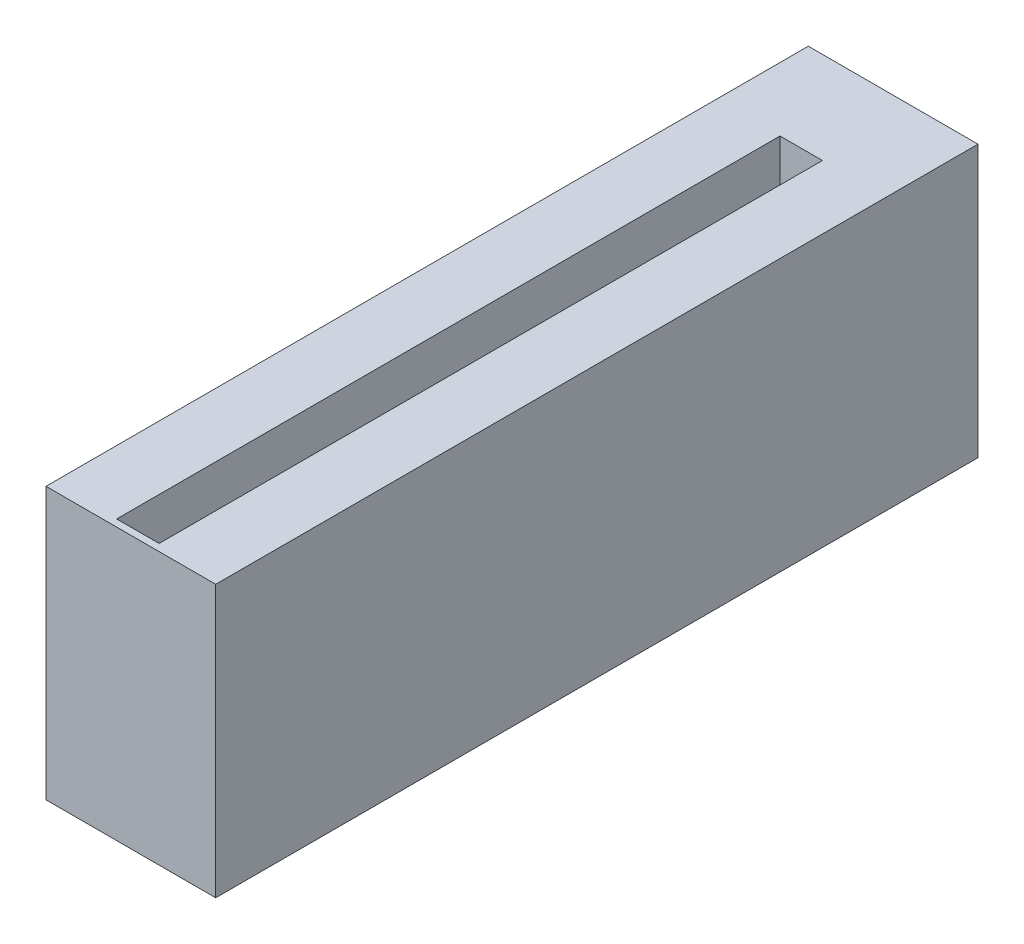
ISO-10303-21;
HEADER;
FILE_DESCRIPTION(('STEP AP214'),'2;1');
FILE_NAME('part.step','',(''),(''),'','','');
FILE_SCHEMA(('AUTOMOTIVE_DESIGN { 1 0 10303 214 1 1 1 1 }'));
ENDSEC;
DATA;
#1=APPLICATION_CONTEXT('core data for automotive mechanical design processes');
#2=APPLICATION_PROTOCOL_DEFINITION('international standard','automotive_design',2000,#1);
#3=PRODUCT_CONTEXT('',#1,'mechanical');
#4=PRODUCT('Part','Part','',(#3));
#5=PRODUCT_RELATED_PRODUCT_CATEGORY('part','',(#4));
#6=PRODUCT_DEFINITION_FORMATION('','',#4);
#7=PRODUCT_DEFINITION_CONTEXT('part definition',#1,'design');
#8=PRODUCT_DEFINITION('design','',#6,#7);
#9=PRODUCT_DEFINITION_SHAPE('','',#8);
#10=(LENGTH_UNIT() NAMED_UNIT(*) SI_UNIT(.MILLI.,.METRE.));
#11=(NAMED_UNIT(*) PLANE_ANGLE_UNIT() SI_UNIT($,.RADIAN.));
#12=(NAMED_UNIT(*) SI_UNIT($,.STERADIAN.) SOLID_ANGLE_UNIT());
#13=UNCERTAINTY_MEASURE_WITH_UNIT(LENGTH_MEASURE(1.E-05),#10,'distance_accuracy_value','');
#14=(GEOMETRIC_REPRESENTATION_CONTEXT(3) GLOBAL_UNCERTAINTY_ASSIGNED_CONTEXT((#13)) GLOBAL_UNIT_ASSIGNED_CONTEXT((#10,
#11,#12)) REPRESENTATION_CONTEXT('',''));
#15=CARTESIAN_POINT('',(0.,0.,0.));
#16=DIRECTION('',(0.,0.,1.));
#17=DIRECTION('',(1.,0.,0.));
#18=AXIS2_PLACEMENT_3D('',#15,#16,#17);
#19=CARTESIAN_POINT('',(2.25,-26.9917116908135,-26.95));
#20=DIRECTION('',(-1.,0.,0.));
#21=DIRECTION('',(0.,0.,1.));
#22=AXIS2_PLACEMENT_3D('',#19,#20,#21);
#23=PLANE('',#22);
#24=DIRECTION('',(0.,0.,1.));
#25=VECTOR('',#24,1.);
#26=CARTESIAN_POINT('',(2.25,0.,-26.95));
#27=LINE('',#26,#25);
#28=CARTESIAN_POINT('',(2.25,0.,-23.7));
#29=VERTEX_POINT('',#28);
#30=CARTESIAN_POINT('',(2.25,0.,-0.25));
#31=VERTEX_POINT('',#30);
#32=EDGE_CURVE('E57',#29,#31,#27,.T.);
#33=ORIENTED_EDGE('',*,*,#32,.F.);
#34=DIRECTION('',(0.,1.,0.));
#35=VECTOR('',#34,1.);
#36=CARTESIAN_POINT('',(2.25,-3.57945526581909,-23.7));
#37=LINE('',#36,#35);
#38=CARTESIAN_POINT('',(2.25,9.6,-23.7));
#39=VERTEX_POINT('',#38);
#40=EDGE_CURVE('E50',#29,#39,#37,.T.);
#41=ORIENTED_EDGE('',*,*,#40,.T.);
#42=DIRECTION('',(0.,0.,1.));
#43=VECTOR('',#42,1.);
#44=CARTESIAN_POINT('',(2.25,9.6,-26.95));
#45=LINE('',#44,#43);
#46=CARTESIAN_POINT('',(2.25,9.6,-0.249999999999999));
#47=VERTEX_POINT('',#46);
#48=EDGE_CURVE('E11',#39,#47,#45,.T.);
#49=ORIENTED_EDGE('',*,*,#48,.T.);
#50=DIRECTION('',(0.,1.,0.));
#51=VECTOR('',#50,1.);
#52=CARTESIAN_POINT('',(2.25,-1.52069063257456,-0.249999999999999));
#53=LINE('',#52,#51);
#54=EDGE_CURVE('E138',#31,#47,#53,.T.);
#55=ORIENTED_EDGE('',*,*,#54,.F.);
#56=EDGE_LOOP('',(#33,#41,#49,#55));
#57=FACE_BOUND('',#56,.T.);
#58=ADVANCED_FACE('F33',(#57),#23,.F.);
#59=CARTESIAN_POINT('',(6.,9.6,0.));
#60=DIRECTION('',(0.,0.,1.));
#61=DIRECTION('',(1.,0.,0.));
#62=AXIS2_PLACEMENT_3D('',#59,#60,#61);
#63=PLANE('',#62);
#64=DIRECTION('',(-1.,0.,0.));
#65=VECTOR('',#64,1.);
#66=CARTESIAN_POINT('',(6.,0.,0.));
#67=LINE('',#66,#65);
#68=CARTESIAN_POINT('',(6.,0.,0.));
#69=VERTEX_POINT('',#68);
#70=CARTESIAN_POINT('',(0.,0.,0.));
#71=VERTEX_POINT('',#70);
#72=EDGE_CURVE('E153',#69,#71,#67,.T.);
#73=ORIENTED_EDGE('',*,*,#72,.F.);
#74=DIRECTION('',(0.,-1.,0.));
#75=VECTOR('',#74,1.);
#76=CARTESIAN_POINT('',(6.,9.6,0.));
#77=LINE('',#76,#75);
#78=CARTESIAN_POINT('',(6.,9.6,0.));
#79=VERTEX_POINT('',#78);
#80=EDGE_CURVE('E129',#79,#69,#77,.T.);
#81=ORIENTED_EDGE('',*,*,#80,.F.);
#82=DIRECTION('',(-1.,0.,0.));
#83=VECTOR('',#82,1.);
#84=CARTESIAN_POINT('',(6.,9.6,0.));
#85=LINE('',#84,#83);
#86=CARTESIAN_POINT('',(0.,9.6,0.));
#87=VERTEX_POINT('',#86);
#88=EDGE_CURVE('E143',#79,#87,#85,.T.);
#89=ORIENTED_EDGE('',*,*,#88,.T.);
#90=DIRECTION('',(0.,-1.,0.));
#91=VECTOR('',#90,1.);
#92=CARTESIAN_POINT('',(0.,9.6,0.));
#93=LINE('',#92,#91);
#94=EDGE_CURVE('E146',#87,#71,#93,.T.);
#95=ORIENTED_EDGE('',*,*,#94,.T.);
#96=EDGE_LOOP('',(#73,#81,#89,#95));
#97=FACE_BOUND('',#96,.T.);
#98=ADVANCED_FACE('F35',(#97),#63,.T.);
#99=CARTESIAN_POINT('',(0.,9.6,-26.95));
#100=DIRECTION('',(0.,0.,-1.));
#101=DIRECTION('',(-1.,0.,0.));
#102=AXIS2_PLACEMENT_3D('',#99,#100,#101);
#103=PLANE('',#102);
#104=DIRECTION('',(1.,0.,0.));
#105=VECTOR('',#104,1.);
#106=CARTESIAN_POINT('',(0.,9.6,-26.95));
#107=LINE('',#106,#105);
#108=CARTESIAN_POINT('',(0.,9.6,-26.95));
#109=VERTEX_POINT('',#108);
#110=CARTESIAN_POINT('',(6.,9.6,-26.95));
#111=VERTEX_POINT('',#110);
#112=EDGE_CURVE('E149',#109,#111,#107,.T.);
#113=ORIENTED_EDGE('',*,*,#112,.T.);
#114=DIRECTION('',(0.,-1.,0.));
#115=VECTOR('',#114,1.);
#116=CARTESIAN_POINT('',(6.,9.6,-26.95));
#117=LINE('',#116,#115);
#118=CARTESIAN_POINT('',(6.,0.,-26.95));
#119=VERTEX_POINT('',#118);
#120=EDGE_CURVE('E127',#111,#119,#117,.T.);
#121=ORIENTED_EDGE('',*,*,#120,.T.);
#122=DIRECTION('',(1.,0.,0.));
#123=VECTOR('',#122,1.);
#124=CARTESIAN_POINT('',(0.,0.,-26.95));
#125=LINE('',#124,#123);
#126=CARTESIAN_POINT('',(0.,0.,-26.95));
#127=VERTEX_POINT('',#126);
#128=EDGE_CURVE('E37',#127,#119,#125,.T.);
#129=ORIENTED_EDGE('',*,*,#128,.F.);
#130=DIRECTION('',(0.,-1.,0.));
#131=VECTOR('',#130,1.);
#132=CARTESIAN_POINT('',(0.,9.6,-26.95));
#133=LINE('',#132,#131);
#134=EDGE_CURVE('E42',#109,#127,#133,.T.);
#135=ORIENTED_EDGE('',*,*,#134,.F.);
#136=EDGE_LOOP('',(#113,#121,#129,#135));
#137=FACE_BOUND('',#136,.T.);
#138=ADVANCED_FACE('F169',(#137),#103,.T.);
#139=CARTESIAN_POINT('',(0.,9.6,0.));
#140=DIRECTION('',(0.,-1.,0.));
#141=DIRECTION('',(0.,0.,-1.));
#142=AXIS2_PLACEMENT_3D('',#139,#140,#141);
#143=PLANE('',#142);
#144=ORIENTED_EDGE('',*,*,#48,.F.);
#145=DIRECTION('',(1.,0.,0.));
#146=VECTOR('',#145,1.);
#147=CARTESIAN_POINT('',(3.75,9.6,-23.7));
#148=LINE('',#147,#146);
#149=CARTESIAN_POINT('',(3.75,9.6,-23.7));
#150=VERTEX_POINT('',#149);
#151=EDGE_CURVE('E102',#39,#150,#148,.T.);
#152=ORIENTED_EDGE('',*,*,#151,.T.);
#153=DIRECTION('',(0.,0.,-1.));
#154=VECTOR('',#153,1.);
#155=CARTESIAN_POINT('',(3.75,9.6,0.));
#156=LINE('',#155,#154);
#157=CARTESIAN_POINT('',(3.75,9.6,-0.249999999999999));
#158=VERTEX_POINT('',#157);
#159=EDGE_CURVE('E111',#158,#150,#156,.T.);
#160=ORIENTED_EDGE('',*,*,#159,.F.);
#161=DIRECTION('',(-1.,0.,0.));
#162=VECTOR('',#161,1.);
#163=CARTESIAN_POINT('',(2.25,9.6,-0.249999999999999));
#164=LINE('',#163,#162);
#165=EDGE_CURVE('E132',#158,#47,#164,.T.);
#166=ORIENTED_EDGE('',*,*,#165,.T.);
#167=EDGE_LOOP('',(#144,#152,#160,#166));
#168=FACE_BOUND('',#167,.T.);
#169=ORIENTED_EDGE('',*,*,#88,.F.);
#170=DIRECTION('',(0.,0.,1.));
#171=VECTOR('',#170,1.);
#172=CARTESIAN_POINT('',(6.,9.6,-26.95));
#173=LINE('',#172,#171);
#174=EDGE_CURVE('E121',#111,#79,#173,.T.);
#175=ORIENTED_EDGE('',*,*,#174,.F.);
#176=ORIENTED_EDGE('',*,*,#112,.F.);
#177=DIRECTION('',(0.,0.,-1.));
#178=VECTOR('',#177,1.);
#179=CARTESIAN_POINT('',(0.,9.6,0.));
#180=LINE('',#179,#178);
#181=EDGE_CURVE('E145',#87,#109,#180,.T.);
#182=ORIENTED_EDGE('',*,*,#181,.F.);
#183=EDGE_LOOP('',(#169,#175,#176,#182));
#184=FACE_BOUND('',#183,.T.);
#185=ADVANCED_FACE('F175',(#168,#184),#143,.F.);
#186=CARTESIAN_POINT('',(0.,0.,0.));
#187=DIRECTION('',(0.,-1.,0.));
#188=DIRECTION('',(0.,0.,-1.));
#189=AXIS2_PLACEMENT_3D('',#186,#187,#188);
#190=PLANE('',#189);
#191=DIRECTION('',(1.,0.,0.));
#192=VECTOR('',#191,1.);
#193=CARTESIAN_POINT('',(3.75,0.,-23.7));
#194=LINE('',#193,#192);
#195=CARTESIAN_POINT('',(3.75,0.,-23.7));
#196=VERTEX_POINT('',#195);
#197=EDGE_CURVE('E96',#29,#196,#194,.T.);
#198=ORIENTED_EDGE('',*,*,#197,.F.);
#199=ORIENTED_EDGE('',*,*,#32,.T.);
#200=DIRECTION('',(-1.,0.,0.));
#201=VECTOR('',#200,1.);
#202=CARTESIAN_POINT('',(2.25,0.,-0.249999999999999));
#203=LINE('',#202,#201);
#204=CARTESIAN_POINT('',(3.75,0.,-0.249999999999999));
#205=VERTEX_POINT('',#204);
#206=EDGE_CURVE('E116',#205,#31,#203,.T.);
#207=ORIENTED_EDGE('',*,*,#206,.F.);
#208=DIRECTION('',(0.,0.,-1.));
#209=VECTOR('',#208,1.);
#210=CARTESIAN_POINT('',(3.75,0.,0.));
#211=LINE('',#210,#209);
#212=EDGE_CURVE('E109',#205,#196,#211,.T.);
#213=ORIENTED_EDGE('',*,*,#212,.T.);
#214=EDGE_LOOP('',(#198,#199,#207,#213));
#215=FACE_BOUND('',#214,.T.);
#216=ORIENTED_EDGE('',*,*,#128,.T.);
#217=DIRECTION('',(0.,0.,1.));
#218=VECTOR('',#217,1.);
#219=CARTESIAN_POINT('',(6.,0.,-26.95));
#220=LINE('',#219,#218);
#221=EDGE_CURVE('E118',#119,#69,#220,.T.);
#222=ORIENTED_EDGE('',*,*,#221,.T.);
#223=ORIENTED_EDGE('',*,*,#72,.T.);
#224=DIRECTION('',(0.,0.,-1.));
#225=VECTOR('',#224,1.);
#226=CARTESIAN_POINT('',(0.,0.,0.));
#227=LINE('',#226,#225);
#228=EDGE_CURVE('E150',#71,#127,#227,.T.);
#229=ORIENTED_EDGE('',*,*,#228,.T.);
#230=EDGE_LOOP('',(#216,#222,#223,#229));
#231=FACE_BOUND('',#230,.T.);
#232=ADVANCED_FACE('F113',(#215,#231),#190,.T.);
#233=CARTESIAN_POINT('',(0.,9.6,0.));
#234=DIRECTION('',(-1.,0.,0.));
#235=DIRECTION('',(0.,0.,1.));
#236=AXIS2_PLACEMENT_3D('',#233,#234,#235);
#237=PLANE('',#236);
#238=ORIENTED_EDGE('',*,*,#228,.F.);
#239=ORIENTED_EDGE('',*,*,#94,.F.);
#240=ORIENTED_EDGE('',*,*,#181,.T.);
#241=ORIENTED_EDGE('',*,*,#134,.T.);
#242=EDGE_LOOP('',(#238,#239,#240,#241));
#243=FACE_BOUND('',#242,.T.);
#244=ADVANCED_FACE('F165',(#243),#237,.T.);
#245=CARTESIAN_POINT('',(2.25,-1.52069063257456,-0.249999999999999));
#246=DIRECTION('',(0.,0.,-1.));
#247=DIRECTION('',(-1.,0.,0.));
#248=AXIS2_PLACEMENT_3D('',#245,#246,#247);
#249=PLANE('',#248);
#250=DIRECTION('',(0.,1.,0.));
#251=VECTOR('',#250,1.);
#252=CARTESIAN_POINT('',(3.75,-1.52069063257456,-0.249999999999999));
#253=LINE('',#252,#251);
#254=EDGE_CURVE('E141',#205,#158,#253,.T.);
#255=ORIENTED_EDGE('',*,*,#254,.F.);
#256=ORIENTED_EDGE('',*,*,#206,.T.);
#257=ORIENTED_EDGE('',*,*,#54,.T.);
#258=ORIENTED_EDGE('',*,*,#165,.F.);
#259=EDGE_LOOP('',(#255,#256,#257,#258));
#260=FACE_BOUND('',#259,.T.);
#261=ADVANCED_FACE('F194',(#260),#249,.T.);
#262=CARTESIAN_POINT('',(3.75,-26.9917116908135,0.));
#263=DIRECTION('',(1.,0.,0.));
#264=DIRECTION('',(0.,0.,-1.));
#265=AXIS2_PLACEMENT_3D('',#262,#263,#264);
#266=PLANE('',#265);
#267=ORIENTED_EDGE('',*,*,#159,.T.);
#268=DIRECTION('',(0.,1.,0.));
#269=VECTOR('',#268,1.);
#270=CARTESIAN_POINT('',(3.75,-3.57945526581909,-23.7));
#271=LINE('',#270,#269);
#272=EDGE_CURVE('E99',#196,#150,#271,.T.);
#273=ORIENTED_EDGE('',*,*,#272,.F.);
#274=ORIENTED_EDGE('',*,*,#212,.F.);
#275=ORIENTED_EDGE('',*,*,#254,.T.);
#276=EDGE_LOOP('',(#267,#273,#274,#275));
#277=FACE_BOUND('',#276,.T.);
#278=ADVANCED_FACE('F107',(#277),#266,.F.);
#279=CARTESIAN_POINT('',(6.,9.6,-26.95));
#280=DIRECTION('',(1.,0.,0.));
#281=DIRECTION('',(0.,0.,-1.));
#282=AXIS2_PLACEMENT_3D('',#279,#280,#281);
#283=PLANE('',#282);
#284=ORIENTED_EDGE('',*,*,#221,.F.);
#285=ORIENTED_EDGE('',*,*,#120,.F.);
#286=ORIENTED_EDGE('',*,*,#174,.T.);
#287=ORIENTED_EDGE('',*,*,#80,.T.);
#288=EDGE_LOOP('',(#284,#285,#286,#287));
#289=FACE_BOUND('',#288,.T.);
#290=ADVANCED_FACE('F173',(#289),#283,.T.);
#291=CARTESIAN_POINT('',(3.75,-3.57945526581909,-23.7));
#292=DIRECTION('',(0.,0.,1.));
#293=DIRECTION('',(1.,0.,0.));
#294=AXIS2_PLACEMENT_3D('',#291,#292,#293);
#295=PLANE('',#294);
#296=ORIENTED_EDGE('',*,*,#40,.F.);
#297=ORIENTED_EDGE('',*,*,#197,.T.);
#298=ORIENTED_EDGE('',*,*,#272,.T.);
#299=ORIENTED_EDGE('',*,*,#151,.F.);
#300=EDGE_LOOP('',(#296,#297,#298,#299));
#301=FACE_BOUND('',#300,.T.);
#302=ADVANCED_FACE('F98',(#301),#295,.T.);
#303=CLOSED_SHELL('',(#58,#98,#138,#185,#232,#244,#261,#278,#290,#302));
#304=MANIFOLD_SOLID_BREP('B2',#303);
#305=ADVANCED_BREP_SHAPE_REPRESENTATION('',(#18,#304),#14);
#306=SHAPE_DEFINITION_REPRESENTATION(#9,#305);
ENDSEC;
END-ISO-10303-21;
